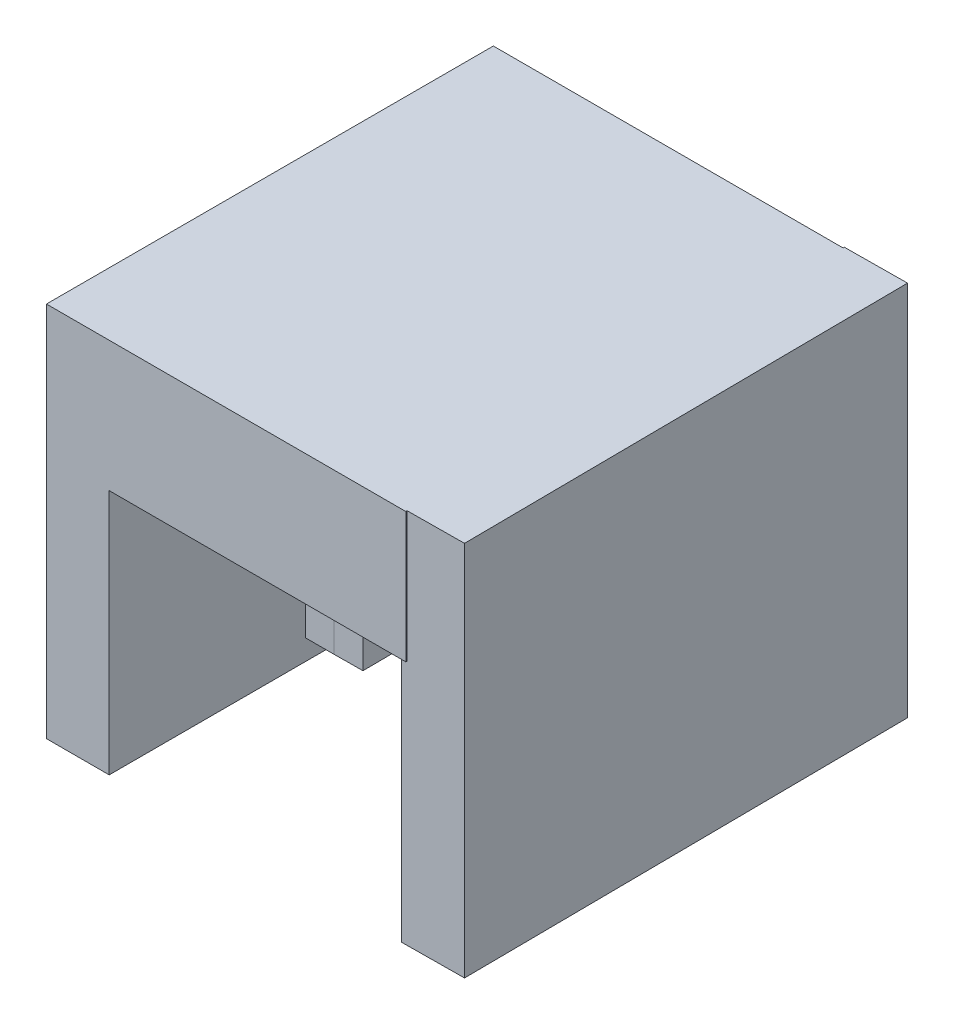
ISO-10303-21;
HEADER;
FILE_DESCRIPTION(('STEP AP214'),'2;1');
FILE_NAME('part.step','',(''),(''),'','','');
FILE_SCHEMA(('AUTOMOTIVE_DESIGN { 1 0 10303 214 1 1 1 1 }'));
ENDSEC;
DATA;
#1=APPLICATION_CONTEXT('core data for automotive mechanical design processes');
#2=APPLICATION_PROTOCOL_DEFINITION('international standard','automotive_design',2000,#1);
#3=PRODUCT_CONTEXT('',#1,'mechanical');
#4=PRODUCT('Part','Part','',(#3));
#5=PRODUCT_RELATED_PRODUCT_CATEGORY('part','',(#4));
#6=PRODUCT_DEFINITION_FORMATION('','',#4);
#7=PRODUCT_DEFINITION_CONTEXT('part definition',#1,'design');
#8=PRODUCT_DEFINITION('design','',#6,#7);
#9=PRODUCT_DEFINITION_SHAPE('','',#8);
#10=(LENGTH_UNIT() NAMED_UNIT(*) SI_UNIT(.MILLI.,.METRE.));
#11=(NAMED_UNIT(*) PLANE_ANGLE_UNIT() SI_UNIT($,.RADIAN.));
#12=(NAMED_UNIT(*) SI_UNIT($,.STERADIAN.) SOLID_ANGLE_UNIT());
#13=UNCERTAINTY_MEASURE_WITH_UNIT(LENGTH_MEASURE(1.E-05),#10,'distance_accuracy_value','');
#14=(GEOMETRIC_REPRESENTATION_CONTEXT(3) GLOBAL_UNCERTAINTY_ASSIGNED_CONTEXT((#13)) GLOBAL_UNIT_ASSIGNED_CONTEXT((#10,
#11,#12)) REPRESENTATION_CONTEXT('',''));
#15=CARTESIAN_POINT('',(0.,0.,0.));
#16=DIRECTION('',(0.,0.,1.));
#17=DIRECTION('',(1.,0.,0.));
#18=AXIS2_PLACEMENT_3D('',#15,#16,#17);
#19=CARTESIAN_POINT('',(27.9970189702549,33.,-26.1043973727644));
#20=DIRECTION('',(1.,0.,0.));
#21=DIRECTION('',(0.,0.,-1.));
#22=AXIS2_PLACEMENT_3D('',#19,#20,#21);
#23=PLANE('',#22);
#24=DIRECTION('',(0.,0.,1.));
#25=VECTOR('',#24,1.);
#26=CARTESIAN_POINT('',(27.9970189702549,21.5839544086407,-26.1043973727644));
#27=LINE('',#26,#25);
#28=CARTESIAN_POINT('',(27.9970189702549,21.5839544086407,-31.9709533691748));
#29=VERTEX_POINT('',#28);
#30=CARTESIAN_POINT('',(27.9970189702549,21.5839544086407,-26.1043973727644));
#31=VERTEX_POINT('',#30);
#32=EDGE_CURVE('E262',#29,#31,#27,.T.);
#33=ORIENTED_EDGE('',*,*,#32,.F.);
#34=DIRECTION('',(0.,-1.,0.));
#35=VECTOR('',#34,1.);
#36=CARTESIAN_POINT('',(27.9970189702549,33.,-31.9709533691748));
#37=LINE('',#36,#35);
#38=CARTESIAN_POINT('',(27.9970189702549,12.,-31.9709533691748));
#39=VERTEX_POINT('',#38);
#40=EDGE_CURVE('E360',#29,#39,#37,.T.);
#41=ORIENTED_EDGE('',*,*,#40,.T.);
#42=DIRECTION('',(0.,0.,1.));
#43=VECTOR('',#42,1.);
#44=CARTESIAN_POINT('',(27.9970189702549,12.,-31.9709533691748));
#45=LINE('',#44,#43);
#46=CARTESIAN_POINT('',(27.9970189702549,12.,-26.1043973727644));
#47=VERTEX_POINT('',#46);
#48=EDGE_CURVE('E337',#39,#47,#45,.T.);
#49=ORIENTED_EDGE('',*,*,#48,.T.);
#50=DIRECTION('',(0.,-1.,0.));
#51=VECTOR('',#50,1.);
#52=CARTESIAN_POINT('',(27.9970189702549,33.,-26.1043973727644));
#53=LINE('',#52,#51);
#54=EDGE_CURVE('E40',#31,#47,#53,.T.);
#55=ORIENTED_EDGE('',*,*,#54,.F.);
#56=EDGE_LOOP('',(#33,#41,#49,#55));
#57=FACE_BOUND('',#56,.T.);
#58=ADVANCED_FACE('F33',(#57),#23,.F.);
#59=CARTESIAN_POINT('',(27.9970189702549,33.,-26.1043973727644));
#60=DIRECTION('',(0.,0.,-1.));
#61=DIRECTION('',(-1.,0.,0.));
#62=AXIS2_PLACEMENT_3D('',#59,#60,#61);
#63=PLANE('',#62);
#64=DIRECTION('',(1.,0.,0.));
#65=VECTOR('',#64,1.);
#66=CARTESIAN_POINT('',(27.9970189702549,21.5839544086407,-26.1043973727644));
#67=LINE('',#66,#65);
#68=CARTESIAN_POINT('',(30.4970193885017,21.5839544086407,-26.1043973727644));
#69=VERTEX_POINT('',#68);
#70=EDGE_CURVE('E264',#31,#69,#67,.T.);
#71=ORIENTED_EDGE('',*,*,#70,.F.);
#72=ORIENTED_EDGE('',*,*,#54,.T.);
#73=DIRECTION('',(-1.,0.,0.));
#74=VECTOR('',#73,1.);
#75=CARTESIAN_POINT('',(27.9970189702549,12.,-26.1043973727643));
#76=LINE('',#75,#74);
#77=CARTESIAN_POINT('',(30.4970193884969,12.,-26.1043973727643));
#78=VERTEX_POINT('',#77);
#79=EDGE_CURVE('E292',#78,#47,#76,.T.);
#80=ORIENTED_EDGE('',*,*,#79,.F.);
#81=DIRECTION('',(0.,-1.,0.));
#82=VECTOR('',#81,1.);
#83=CARTESIAN_POINT('',(30.4970193885017,33.,-26.1043973727644));
#84=LINE('',#83,#82);
#85=EDGE_CURVE('E427',#69,#78,#84,.T.);
#86=ORIENTED_EDGE('',*,*,#85,.F.);
#87=EDGE_LOOP('',(#71,#72,#80,#86));
#88=FACE_BOUND('',#87,.T.);
#89=ADVANCED_FACE('F440',(#88),#63,.F.);
#90=CARTESIAN_POINT('',(32.9969268277988,33.,-26.1259585921443));
#91=DIRECTION('',(-0.00862448630909563,0.,-0.999962808426345));
#92=DIRECTION('',(-0.999962808426346,0.,0.00862448630909563));
#93=AXIS2_PLACEMENT_3D('',#90,#91,#92);
#94=PLANE('',#93);
#95=DIRECTION('',(0.999962808426346,0.,-0.00862448630909563));
#96=VECTOR('',#95,1.);
#97=CARTESIAN_POINT('',(32.9969268277988,21.5839544086407,-26.1259585921443));
#98=LINE('',#97,#96);
#99=CARTESIAN_POINT('',(32.9969268277988,21.5839544086407,-26.1259585921443));
#100=VERTEX_POINT('',#99);
#101=EDGE_CURVE('E266',#69,#100,#98,.T.);
#102=ORIENTED_EDGE('',*,*,#101,.F.);
#103=ORIENTED_EDGE('',*,*,#85,.T.);
#104=DIRECTION('',(0.999962808426346,0.,-0.00862448630909563));
#105=VECTOR('',#104,1.);
#106=CARTESIAN_POINT('',(32.9969268277988,12.,-26.1259585921443));
#107=LINE('',#106,#105);
#108=CARTESIAN_POINT('',(32.9969268277988,12.,-26.1259585921443));
#109=VERTEX_POINT('',#108);
#110=EDGE_CURVE('E297',#78,#109,#107,.T.);
#111=ORIENTED_EDGE('',*,*,#110,.T.);
#112=DIRECTION('',(0.,-1.,0.));
#113=VECTOR('',#112,1.);
#114=CARTESIAN_POINT('',(32.9969268277988,33.,-26.1259585921443));
#115=LINE('',#114,#113);
#116=EDGE_CURVE('E425',#100,#109,#115,.T.);
#117=ORIENTED_EDGE('',*,*,#116,.F.);
#118=EDGE_LOOP('',(#102,#103,#111,#117));
#119=FACE_BOUND('',#118,.T.);
#120=ADVANCED_FACE('F432',(#119),#94,.F.);
#121=CARTESIAN_POINT('',(32.9969268277988,33.,-26.1259585921443));
#122=DIRECTION('',(-0.999962808426345,0.,0.00862448630909741));
#123=DIRECTION('',(0.00862448630909741,0.,0.999962808426346));
#124=AXIS2_PLACEMENT_3D('',#121,#122,#123);
#125=PLANE('',#124);
#126=DIRECTION('',(-0.00862448630909741,0.,-0.999962808426346));
#127=VECTOR('',#126,1.);
#128=CARTESIAN_POINT('',(32.9969268277988,21.5839544086407,-26.1259585921443));
#129=LINE('',#128,#127);
#130=CARTESIAN_POINT('',(32.9463307959262,21.5839544086407,-31.9922964021052));
#131=VERTEX_POINT('',#130);
#132=EDGE_CURVE('E268',#100,#131,#129,.T.);
#133=ORIENTED_EDGE('',*,*,#132,.F.);
#134=ORIENTED_EDGE('',*,*,#116,.T.);
#135=DIRECTION('',(-0.00862448630909741,0.,-0.999962808426346));
#136=VECTOR('',#135,1.);
#137=CARTESIAN_POINT('',(32.9969268277988,12.,-26.1259585921443));
#138=LINE('',#137,#136);
#139=CARTESIAN_POINT('',(32.9463307959262,12.,-31.9922964021052));
#140=VERTEX_POINT('',#139);
#141=EDGE_CURVE('E335',#109,#140,#138,.T.);
#142=ORIENTED_EDGE('',*,*,#141,.T.);
#143=DIRECTION('',(0.,-1.,0.));
#144=VECTOR('',#143,1.);
#145=CARTESIAN_POINT('',(32.9463307959262,33.,-31.9922964021052));
#146=LINE('',#145,#144);
#147=EDGE_CURVE('E54',#131,#140,#146,.T.);
#148=ORIENTED_EDGE('',*,*,#147,.F.);
#149=EDGE_LOOP('',(#133,#134,#142,#148));
#150=FACE_BOUND('',#149,.T.);
#151=ADVANCED_FACE('F446',(#150),#125,.F.);
#152=CARTESIAN_POINT('',(30.4738372348107,33.,-37.7049418751643));
#153=DIRECTION('',(0.,-1.,0.));
#154=DIRECTION('',(0.,0.,-1.));
#155=AXIS2_PLACEMENT_3D('',#152,#153,#154);
#156=CYLINDRICAL_SURFACE('',#155,6.22475242163252);
#157=CARTESIAN_POINT('',(30.4738372348107,21.5839544086407,-37.7049418751643));
#158=DIRECTION('',(0.,1.,0.));
#159=DIRECTION('',(0.,0.,1.));
#160=AXIS2_PLACEMENT_3D('',#157,#158,#159);
#161=CIRCLE('',#160,6.22475242163252);
#162=CARTESIAN_POINT('',(35.8638647298149,21.5839544086407,-34.5912388845566));
#163=VERTEX_POINT('',#162);
#164=EDGE_CURVE('E270',#131,#163,#161,.T.);
#165=ORIENTED_EDGE('',*,*,#164,.F.);
#166=ORIENTED_EDGE('',*,*,#147,.T.);
#167=CARTESIAN_POINT('',(30.4738372348107,12.,-37.7049418751644));
#168=DIRECTION('',(0.,1.,0.));
#169=DIRECTION('',(0.,0.,1.));
#170=AXIS2_PLACEMENT_3D('',#167,#168,#169);
#171=CIRCLE('',#170,6.22475242163263);
#172=CARTESIAN_POINT('',(35.8638647298149,12.,-34.5912388845566));
#173=VERTEX_POINT('',#172);
#174=EDGE_CURVE('E333',#140,#173,#171,.T.);
#175=ORIENTED_EDGE('',*,*,#174,.T.);
#176=DIRECTION('',(0.,-1.,0.));
#177=VECTOR('',#176,1.);
#178=CARTESIAN_POINT('',(35.8638647298149,33.,-34.5912388845566));
#179=LINE('',#178,#177);
#180=EDGE_CURVE('E422',#163,#173,#179,.T.);
#181=ORIENTED_EDGE('',*,*,#180,.F.);
#182=EDGE_LOOP('',(#165,#166,#175,#181));
#183=FACE_BOUND('',#182,.T.);
#184=ADVANCED_FACE('F452',(#183),#156,.T.);
#185=CARTESIAN_POINT('',(35.8638647298149,33.,-34.5912388845566));
#186=DIRECTION('',(-0.246647604540995,0.,-0.969105236377448));
#187=DIRECTION('',(-0.969105236377448,0.,0.246647604540995));
#188=AXIS2_PLACEMENT_3D('',#185,#186,#187);
#189=PLANE('',#188);
#190=DIRECTION('',(0.969105236377448,0.,-0.246647604540995));
#191=VECTOR('',#190,1.);
#192=CARTESIAN_POINT('',(35.8638647298149,21.5839544086407,-34.5912388845566));
#193=LINE('',#192,#191);
#194=CARTESIAN_POINT('',(40.4315397694171,21.5839544086407,-35.7537608321739));
#195=VERTEX_POINT('',#194);
#196=EDGE_CURVE('E272',#163,#195,#193,.T.);
#197=ORIENTED_EDGE('',*,*,#196,.F.);
#198=ORIENTED_EDGE('',*,*,#180,.T.);
#199=DIRECTION('',(0.969105236377448,0.,-0.246647604540994));
#200=VECTOR('',#199,1.);
#201=CARTESIAN_POINT('',(35.8638647298149,12.,-34.5912388845566));
#202=LINE('',#201,#200);
#203=CARTESIAN_POINT('',(40.4315397694171,12.,-35.7537608321739));
#204=VERTEX_POINT('',#203);
#205=EDGE_CURVE('E330',#173,#204,#202,.T.);
#206=ORIENTED_EDGE('',*,*,#205,.T.);
#207=DIRECTION('',(0.,-1.,0.));
#208=VECTOR('',#207,1.);
#209=CARTESIAN_POINT('',(40.4315397694171,33.,-35.7537608321739));
#210=LINE('',#209,#208);
#211=EDGE_CURVE('E420',#195,#204,#210,.T.);
#212=ORIENTED_EDGE('',*,*,#211,.F.);
#213=EDGE_LOOP('',(#197,#198,#206,#212));
#214=FACE_BOUND('',#213,.T.);
#215=ADVANCED_FACE('F456',(#214),#189,.F.);
#216=CARTESIAN_POINT('',(40.4315397694171,33.,-35.7537608321739));
#217=DIRECTION('',(0.192290170789592,0.,-0.981338112078457));
#218=DIRECTION('',(-0.981338112078457,0.,-0.192290170789592));
#219=AXIS2_PLACEMENT_3D('',#216,#217,#218);
#220=PLANE('',#219);
#221=DIRECTION('',(0.981338112078457,0.,0.192290170789592));
#222=VECTOR('',#221,1.);
#223=CARTESIAN_POINT('',(40.4315397694171,21.5839544086407,-35.7537608321739));
#224=LINE('',#223,#222);
#225=CARTESIAN_POINT('',(43.1362110965658,21.5839544086407,-35.223788842881));
#226=VERTEX_POINT('',#225);
#227=EDGE_CURVE('E274',#195,#226,#224,.T.);
#228=ORIENTED_EDGE('',*,*,#227,.F.);
#229=ORIENTED_EDGE('',*,*,#211,.T.);
#230=DIRECTION('',(0.981338112078457,0.,0.192290170789592));
#231=VECTOR('',#230,1.);
#232=CARTESIAN_POINT('',(40.4315397694171,12.,-35.7537608321739));
#233=LINE('',#232,#231);
#234=CARTESIAN_POINT('',(43.1362110965658,12.,-35.223788842881));
#235=VERTEX_POINT('',#234);
#236=EDGE_CURVE('E327',#204,#235,#233,.T.);
#237=ORIENTED_EDGE('',*,*,#236,.T.);
#238=DIRECTION('',(0.,-1.,0.));
#239=VECTOR('',#238,1.);
#240=CARTESIAN_POINT('',(43.1362110965658,33.,-35.223788842881));
#241=LINE('',#240,#239);
#242=EDGE_CURVE('E418',#226,#235,#241,.T.);
#243=ORIENTED_EDGE('',*,*,#242,.F.);
#244=EDGE_LOOP('',(#228,#229,#237,#243));
#245=FACE_BOUND('',#244,.T.);
#246=ADVANCED_FACE('F459',(#245),#220,.F.);
#247=CARTESIAN_POINT('',(43.2743821323213,33.,-19.203600276804));
#248=DIRECTION('',(-0.00862448630909776,0.,-0.999962808426345));
#249=DIRECTION('',(-0.999962808426346,0.,0.00862448630909776));
#250=AXIS2_PLACEMENT_3D('',#247,#248,#249);
#251=PLANE('',#250);
#252=DIRECTION('',(0.999962808426346,0.,-0.00862448630909776));
#253=VECTOR('',#252,1.);
#254=CARTESIAN_POINT('',(43.2743821323213,21.5839544086407,-19.203600276804));
#255=LINE('',#254,#253);
#256=CARTESIAN_POINT('',(43.2743821323213,21.5839544086407,-19.203600276804));
#257=VERTEX_POINT('',#256);
#258=CARTESIAN_POINT('',(43.7796476849856,21.5839544086407,-19.2079580947195));
#259=VERTEX_POINT('',#258);
#260=EDGE_CURVE('E231',#257,#259,#255,.T.);
#261=ORIENTED_EDGE('',*,*,#260,.F.);
#262=DIRECTION('',(0.,-1.,0.));
#263=VECTOR('',#262,1.);
#264=CARTESIAN_POINT('',(43.2743821323213,33.,-19.203600276804));
#265=LINE('',#264,#263);
#266=CARTESIAN_POINT('',(43.2743821323213,0.,-19.203600276804));
#267=VERTEX_POINT('',#266);
#268=EDGE_CURVE('E416',#257,#267,#265,.T.);
#269=ORIENTED_EDGE('',*,*,#268,.T.);
#270=DIRECTION('',(0.999962808426345,0.,-0.00862448630909776));
#271=VECTOR('',#270,1.);
#272=CARTESIAN_POINT('',(43.2743821323213,0.,-19.203600276804));
#273=LINE('',#272,#271);
#274=CARTESIAN_POINT('',(48.7741775786662,0.,-19.251034951504));
#275=VERTEX_POINT('',#274);
#276=EDGE_CURVE('E304',#267,#275,#273,.T.);
#277=ORIENTED_EDGE('',*,*,#276,.T.);
#278=DIRECTION('',(0.,-1.,0.));
#279=VECTOR('',#278,1.);
#280=CARTESIAN_POINT('',(48.7741775786662,33.,-19.251034951504));
#281=LINE('',#280,#279);
#282=CARTESIAN_POINT('',(48.7741775786662,33.,-19.251034951504));
#283=VERTEX_POINT('',#282);
#284=EDGE_CURVE('E413',#283,#275,#281,.T.);
#285=ORIENTED_EDGE('',*,*,#284,.F.);
#286=DIRECTION('',(0.999962808426345,0.,-0.00862448630909776));
#287=VECTOR('',#286,1.);
#288=CARTESIAN_POINT('',(43.2743821323213,33.,-19.203600276804));
#289=LINE('',#288,#287);
#290=CARTESIAN_POINT('',(43.7796476849856,33.,-19.2079580947195));
#291=VERTEX_POINT('',#290);
#292=EDGE_CURVE('E344',#291,#283,#289,.T.);
#293=ORIENTED_EDGE('',*,*,#292,.F.);
#294=DIRECTION('',(0.,-1.,0.));
#295=VECTOR('',#294,1.);
#296=CARTESIAN_POINT('',(43.7796476849856,33.,-19.2079580947195));
#297=LINE('',#296,#295);
#298=EDGE_CURVE('E249',#291,#259,#297,.T.);
#299=ORIENTED_EDGE('',*,*,#298,.T.);
#300=EDGE_LOOP('',(#261,#269,#277,#285,#293,#299));
#301=FACE_BOUND('',#300,.T.);
#302=ADVANCED_FACE('F463',(#301),#251,.F.);
#303=CARTESIAN_POINT('',(42.9365132233006,33.,-58.3776833509426));
#304=DIRECTION('',(0.999962808426345,0.,-0.00862448630909662));
#305=DIRECTION('',(-0.00862448630909662,0.,-0.999962808426346));
#306=AXIS2_PLACEMENT_3D('',#303,#304,#305);
#307=PLANE('',#306);
#308=DIRECTION('',(0.00862448630909662,0.,0.999962808426346));
#309=VECTOR('',#308,1.);
#310=CARTESIAN_POINT('',(42.9365132233006,21.5839544086407,-58.3776833509426));
#311=LINE('',#310,#309);
#312=EDGE_CURVE('E276',#226,#257,#311,.T.);
#313=ORIENTED_EDGE('',*,*,#312,.F.);
#314=ORIENTED_EDGE('',*,*,#242,.T.);
#315=DIRECTION('',(-0.0086244863090982,0.,-0.999962808426346));
#316=VECTOR('',#315,1.);
#317=CARTESIAN_POINT('',(43.1362110965658,12.,-35.223788842881));
#318=LINE('',#317,#316);
#319=CARTESIAN_POINT('',(43.0881960389902,12.,-40.7908765625737));
#320=VERTEX_POINT('',#319);
#321=EDGE_CURVE('E324',#235,#320,#318,.T.);
#322=ORIENTED_EDGE('',*,*,#321,.T.);
#323=DIRECTION('',(0.,-1.,0.));
#324=VECTOR('',#323,1.);
#325=CARTESIAN_POINT('',(43.0881960389902,33.,-40.7908765625737));
#326=LINE('',#325,#324);
#327=CARTESIAN_POINT('',(43.0881960389902,21.5839544086407,-40.7908765625737));
#328=VERTEX_POINT('',#327);
#329=EDGE_CURVE('E405',#328,#320,#326,.T.);
#330=ORIENTED_EDGE('',*,*,#329,.F.);
#331=CARTESIAN_POINT('',(42.9374488815168,21.5839544086407,-58.2691988123798));
#332=VERTEX_POINT('',#331);
#333=EDGE_CURVE('E278',#332,#328,#311,.T.);
#334=ORIENTED_EDGE('',*,*,#333,.F.);
#335=DIRECTION('',(0.,-1.,0.));
#336=VECTOR('',#335,1.);
#337=CARTESIAN_POINT('',(42.9374488815168,33.,-58.2691988123798));
#338=LINE('',#337,#336);
#339=CARTESIAN_POINT('',(42.9374488815168,33.,-58.2691988123798));
#340=VERTEX_POINT('',#339);
#341=EDGE_CURVE('E252',#340,#332,#338,.T.);
#342=ORIENTED_EDGE('',*,*,#341,.F.);
#343=DIRECTION('',(0.00862448630909662,0.,0.999962808426346));
#344=VECTOR('',#343,1.);
#345=CARTESIAN_POINT('',(42.9365132233006,33.,-58.3776833509426));
#346=LINE('',#345,#344);
#347=CARTESIAN_POINT('',(42.9365132233006,33.,-58.3776833509426));
#348=VERTEX_POINT('',#347);
#349=EDGE_CURVE('E351',#348,#340,#346,.T.);
#350=ORIENTED_EDGE('',*,*,#349,.F.);
#351=DIRECTION('',(0.,-1.,0.));
#352=VECTOR('',#351,1.);
#353=CARTESIAN_POINT('',(42.9365132233006,33.,-58.3776833509426));
#354=LINE('',#353,#352);
#355=CARTESIAN_POINT('',(42.9365132233006,0.,-58.3776833509426));
#356=VERTEX_POINT('',#355);
#357=EDGE_CURVE('E407',#348,#356,#354,.T.);
#358=ORIENTED_EDGE('',*,*,#357,.T.);
#359=DIRECTION('',(0.00862448630909662,0.,0.999962808426346));
#360=VECTOR('',#359,1.);
#361=CARTESIAN_POINT('',(42.9365132233006,0.,-58.3776833509426));
#362=LINE('',#361,#360);
#363=EDGE_CURVE('E366',#356,#267,#362,.T.);
#364=ORIENTED_EDGE('',*,*,#363,.T.);
#365=ORIENTED_EDGE('',*,*,#268,.F.);
#366=EDGE_LOOP('',(#313,#314,#322,#330,#334,#342,#350,#358,#364,#365));
#367=FACE_BOUND('',#366,.T.);
#368=ADVANCED_FACE('F467',(#367),#307,.F.);
#369=CARTESIAN_POINT('',(43.0881960389902,33.,-40.7908765625737));
#370=DIRECTION('',(0.295076846057064,0.,0.955473523924664));
#371=DIRECTION('',(0.955473523924664,0.,-0.295076846057064));
#372=AXIS2_PLACEMENT_3D('',#369,#370,#371);
#373=PLANE('',#372);
#374=DIRECTION('',(-0.955473523924664,0.,0.295076846057064));
#375=VECTOR('',#374,1.);
#376=CARTESIAN_POINT('',(43.0881960389902,21.5839544086407,-40.7908765625737));
#377=LINE('',#376,#375);
#378=CARTESIAN_POINT('',(40.3952684480576,21.5839544086407,-39.9592254908323));
#379=VERTEX_POINT('',#378);
#380=EDGE_CURVE('E290',#328,#379,#377,.T.);
#381=ORIENTED_EDGE('',*,*,#380,.F.);
#382=ORIENTED_EDGE('',*,*,#329,.T.);
#383=DIRECTION('',(-0.955473523924664,0.,0.295076846057064));
#384=VECTOR('',#383,1.);
#385=CARTESIAN_POINT('',(43.0881960389902,12.,-40.7908765625737));
#386=LINE('',#385,#384);
#387=CARTESIAN_POINT('',(40.3952684480576,12.,-39.9592254908323));
#388=VERTEX_POINT('',#387);
#389=EDGE_CURVE('E321',#320,#388,#386,.T.);
#390=ORIENTED_EDGE('',*,*,#389,.T.);
#391=DIRECTION('',(0.,-1.,0.));
#392=VECTOR('',#391,1.);
#393=CARTESIAN_POINT('',(40.3952684480576,33.,-39.9592254908323));
#394=LINE('',#393,#392);
#395=EDGE_CURVE('E403',#379,#388,#394,.T.);
#396=ORIENTED_EDGE('',*,*,#395,.F.);
#397=EDGE_LOOP('',(#381,#382,#390,#396));
#398=FACE_BOUND('',#397,.T.);
#399=ADVANCED_FACE('F481',(#398),#373,.F.);
#400=CARTESIAN_POINT('',(35.8886314142691,33.,-40.7753729043073));
#401=DIRECTION('',(-0.178200359676966,0.,0.983994223464244));
#402=DIRECTION('',(0.983994223464244,0.,0.178200359676966));
#403=AXIS2_PLACEMENT_3D('',#400,#401,#402);
#404=PLANE('',#403);
#405=DIRECTION('',(-0.983994223464244,0.,-0.178200359676966));
#406=VECTOR('',#405,1.);
#407=CARTESIAN_POINT('',(35.8886314142691,21.5839544086407,-40.7753729043073));
#408=LINE('',#407,#406);
#409=CARTESIAN_POINT('',(35.8886314142691,21.5839544086407,-40.7753729043073));
#410=VERTEX_POINT('',#409);
#411=EDGE_CURVE('E288',#379,#410,#408,.T.);
#412=ORIENTED_EDGE('',*,*,#411,.F.);
#413=ORIENTED_EDGE('',*,*,#395,.T.);
#414=DIRECTION('',(-0.983994223464244,0.,-0.178200359676966));
#415=VECTOR('',#414,1.);
#416=CARTESIAN_POINT('',(40.3952684480576,12.,-39.9592254908323));
#417=LINE('',#416,#415);
#418=CARTESIAN_POINT('',(35.8886314142691,12.,-40.7753729043073));
#419=VERTEX_POINT('',#418);
#420=EDGE_CURVE('E318',#388,#419,#417,.T.);
#421=ORIENTED_EDGE('',*,*,#420,.T.);
#422=DIRECTION('',(0.,-1.,0.));
#423=VECTOR('',#422,1.);
#424=CARTESIAN_POINT('',(35.8886314142691,33.,-40.7753729043073));
#425=LINE('',#424,#423);
#426=EDGE_CURVE('E401',#410,#419,#425,.T.);
#427=ORIENTED_EDGE('',*,*,#426,.F.);
#428=EDGE_LOOP('',(#412,#413,#421,#427));
#429=FACE_BOUND('',#428,.T.);
#430=ADVANCED_FACE('F485',(#429),#404,.F.);
#431=CARTESIAN_POINT('',(30.4738372348107,33.,-37.7049418751643));
#432=DIRECTION('',(0.,-1.,0.));
#433=DIRECTION('',(0.,0.,-1.));
#434=AXIS2_PLACEMENT_3D('',#431,#432,#433);
#435=CYLINDRICAL_SURFACE('',#434,6.22475242163252);
#436=CARTESIAN_POINT('',(30.4738372348107,21.5839544086407,-37.7049418751643));
#437=DIRECTION('',(0.,1.,0.));
#438=DIRECTION('',(0.,0.,1.));
#439=AXIS2_PLACEMENT_3D('',#436,#437,#438);
#440=CIRCLE('',#439,6.22475242163252);
#441=CARTESIAN_POINT('',(30.4201519427729,21.5839544086407,-43.9294627884586));
#442=VERTEX_POINT('',#441);
#443=EDGE_CURVE('E286',#410,#442,#440,.T.);
#444=ORIENTED_EDGE('',*,*,#443,.F.);
#445=ORIENTED_EDGE('',*,*,#426,.T.);
#446=CARTESIAN_POINT('',(30.4738372348107,12.,-37.7049418751643));
#447=DIRECTION('',(0.,1.,0.));
#448=DIRECTION('',(0.,0.,1.));
#449=AXIS2_PLACEMENT_3D('',#446,#447,#448);
#450=CIRCLE('',#449,6.22475242163252);
#451=CARTESIAN_POINT('',(30.4201519427729,12.,-43.9294627884587));
#452=VERTEX_POINT('',#451);
#453=EDGE_CURVE('E294',#419,#452,#450,.T.);
#454=ORIENTED_EDGE('',*,*,#453,.T.);
#455=DIRECTION('',(0.,-1.,0.));
#456=VECTOR('',#455,1.);
#457=CARTESIAN_POINT('',(30.4201519427729,33.,-43.9294627884587));
#458=LINE('',#457,#456);
#459=EDGE_CURVE('E399',#442,#452,#458,.T.);
#460=ORIENTED_EDGE('',*,*,#459,.F.);
#461=EDGE_LOOP('',(#444,#445,#454,#460));
#462=FACE_BOUND('',#461,.T.);
#463=ADVANCED_FACE('F489',(#462),#435,.T.);
#464=CARTESIAN_POINT('',(30.4201519427729,33.,-37.7047103668261));
#465=DIRECTION('',(0.,-1.,0.));
#466=DIRECTION('',(0.,0.,-1.));
#467=AXIS2_PLACEMENT_3D('',#464,#465,#466);
#468=CYLINDRICAL_SURFACE('',#467,6.22475242163251);
#469=CARTESIAN_POINT('',(30.4201519427729,21.5839544086407,-37.7047103668261));
#470=DIRECTION('',(0.,1.,0.));
#471=DIRECTION('',(0.,0.,1.));
#472=AXIS2_PLACEMENT_3D('',#469,#470,#471);
#473=CIRCLE('',#472,6.22475242163251);
#474=CARTESIAN_POINT('',(24.9790782576572,21.5839544086407,-40.72832738354));
#475=VERTEX_POINT('',#474);
#476=EDGE_CURVE('E284',#442,#475,#473,.T.);
#477=ORIENTED_EDGE('',*,*,#476,.F.);
#478=ORIENTED_EDGE('',*,*,#459,.T.);
#479=CARTESIAN_POINT('',(30.4201519427729,12.,-37.7047103668261));
#480=DIRECTION('',(0.,1.,0.));
#481=DIRECTION('',(0.,0.,1.));
#482=AXIS2_PLACEMENT_3D('',#479,#480,#481);
#483=CIRCLE('',#482,6.22475242163256);
#484=CARTESIAN_POINT('',(24.9790782576572,12.,-40.72832738354));
#485=VERTEX_POINT('',#484);
#486=EDGE_CURVE('E315',#452,#485,#483,.T.);
#487=ORIENTED_EDGE('',*,*,#486,.T.);
#488=DIRECTION('',(0.,-1.,0.));
#489=VECTOR('',#488,1.);
#490=CARTESIAN_POINT('',(24.9790782576572,33.,-40.72832738354));
#491=LINE('',#490,#489);
#492=EDGE_CURVE('E397',#475,#485,#491,.T.);
#493=ORIENTED_EDGE('',*,*,#492,.F.);
#494=EDGE_LOOP('',(#477,#478,#487,#493));
#495=FACE_BOUND('',#494,.T.);
#496=ADVANCED_FACE('F493',(#495),#468,.T.);
#497=CARTESIAN_POINT('',(24.9790782576572,33.,-40.72832738354));
#498=DIRECTION('',(0.186680176833693,0.,0.98242074060829));
#499=DIRECTION('',(0.98242074060829,0.,-0.186680176833693));
#500=AXIS2_PLACEMENT_3D('',#497,#498,#499);
#501=PLANE('',#500);
#502=DIRECTION('',(-0.98242074060829,0.,0.186680176833693));
#503=VECTOR('',#502,1.);
#504=CARTESIAN_POINT('',(24.9790782576572,21.5839544086407,-40.72832738354));
#505=LINE('',#504,#503);
#506=CARTESIAN_POINT('',(20.4796476849856,21.5839544086407,-39.8733428944736));
#507=VERTEX_POINT('',#506);
#508=EDGE_CURVE('E282',#475,#507,#505,.T.);
#509=ORIENTED_EDGE('',*,*,#508,.F.);
#510=ORIENTED_EDGE('',*,*,#492,.T.);
#511=DIRECTION('',(-0.98242074060829,0.,0.186680176833693));
#512=VECTOR('',#511,1.);
#513=CARTESIAN_POINT('',(20.4796476849856,12.,-39.8733428944736));
#514=LINE('',#513,#512);
#515=CARTESIAN_POINT('',(20.4796476849856,12.,-39.8733428944736));
#516=VERTEX_POINT('',#515);
#517=EDGE_CURVE('E312',#485,#516,#514,.T.);
#518=ORIENTED_EDGE('',*,*,#517,.T.);
#519=DIRECTION('',(0.,-1.,0.));
#520=VECTOR('',#519,1.);
#521=CARTESIAN_POINT('',(20.4796476849856,33.,-39.8733428944736));
#522=LINE('',#521,#520);
#523=EDGE_CURVE('E395',#507,#516,#522,.T.);
#524=ORIENTED_EDGE('',*,*,#523,.F.);
#525=EDGE_LOOP('',(#509,#510,#518,#524));
#526=FACE_BOUND('',#525,.T.);
#527=ADVANCED_FACE('F497',(#526),#501,.F.);
#528=CARTESIAN_POINT('',(17.7796476849856,33.,-40.6817379186636));
#529=DIRECTION('',(-0.286825403359055,0.,0.957982874579664));
#530=DIRECTION('',(0.957982874579664,0.,0.286825403359055));
#531=AXIS2_PLACEMENT_3D('',#528,#529,#530);
#532=PLANE('',#531);
#533=DIRECTION('',(-0.957982874579664,0.,-0.286825403359055));
#534=VECTOR('',#533,1.);
#535=CARTESIAN_POINT('',(17.7796476849856,21.5839544086407,-40.6817379186636));
#536=LINE('',#535,#534);
#537=CARTESIAN_POINT('',(17.7796476849856,21.5839544086407,-40.6817379186636));
#538=VERTEX_POINT('',#537);
#539=EDGE_CURVE('E280',#507,#538,#536,.T.);
#540=ORIENTED_EDGE('',*,*,#539,.F.);
#541=ORIENTED_EDGE('',*,*,#523,.T.);
#542=DIRECTION('',(-0.957982874579664,0.,-0.286825403359055));
#543=VECTOR('',#542,1.);
#544=CARTESIAN_POINT('',(17.7796476849856,12.,-40.6817379186636));
#545=LINE('',#544,#543);
#546=CARTESIAN_POINT('',(17.7796476849856,12.,-40.6817379186636));
#547=VERTEX_POINT('',#546);
#548=EDGE_CURVE('E309',#516,#547,#545,.T.);
#549=ORIENTED_EDGE('',*,*,#548,.T.);
#550=DIRECTION('',(0.,-1.,0.));
#551=VECTOR('',#550,1.);
#552=CARTESIAN_POINT('',(17.7796476849856,33.,-40.6817379186636));
#553=LINE('',#552,#551);
#554=EDGE_CURVE('E393',#538,#547,#553,.T.);
#555=ORIENTED_EDGE('',*,*,#554,.F.);
#556=EDGE_LOOP('',(#540,#541,#549,#555));
#557=FACE_BOUND('',#556,.T.);
#558=ADVANCED_FACE('F501',(#557),#532,.F.);
#559=CARTESIAN_POINT('',(17.7796476849856,33.,-35.1144431425172));
#560=DIRECTION('',(-1.,0.,0.));
#561=DIRECTION('',(0.,0.,1.));
#562=AXIS2_PLACEMENT_3D('',#559,#560,#561);
#563=PLANE('',#562);
#564=DIRECTION('',(0.,0.,-1.));
#565=VECTOR('',#564,1.);
#566=CARTESIAN_POINT('',(17.7796476849856,21.5839544086407,-19.093658738257));
#567=LINE('',#566,#565);
#568=CARTESIAN_POINT('',(17.7796476849856,21.5839544086407,-19.093658738257));
#569=VERTEX_POINT('',#568);
#570=CARTESIAN_POINT('',(17.7796476849856,21.5839544086407,-35.1144431425172));
#571=VERTEX_POINT('',#570);
#572=EDGE_CURVE('E243',#569,#571,#567,.T.);
#573=ORIENTED_EDGE('',*,*,#572,.F.);
#574=DIRECTION('',(0.,-1.,0.));
#575=VECTOR('',#574,1.);
#576=CARTESIAN_POINT('',(17.7796476849856,33.,-19.093658738257));
#577=LINE('',#576,#575);
#578=CARTESIAN_POINT('',(17.7796476849856,0.,-19.093658738257));
#579=VERTEX_POINT('',#578);
#580=EDGE_CURVE('E248',#569,#579,#577,.T.);
#581=ORIENTED_EDGE('',*,*,#580,.T.);
#582=DIRECTION('',(0.,0.,-1.));
#583=VECTOR('',#582,1.);
#584=CARTESIAN_POINT('',(17.7796476849856,0.,-35.1144431425172));
#585=LINE('',#584,#583);
#586=CARTESIAN_POINT('',(17.7796476849856,0.,-58.2691988123798));
#587=VERTEX_POINT('',#586);
#588=EDGE_CURVE('E347',#579,#587,#585,.T.);
#589=ORIENTED_EDGE('',*,*,#588,.T.);
#590=DIRECTION('',(0.,-1.,0.));
#591=VECTOR('',#590,1.);
#592=CARTESIAN_POINT('',(17.7796476849856,33.,-58.2691988123798));
#593=LINE('',#592,#591);
#594=CARTESIAN_POINT('',(17.7796476849856,21.5839544086407,-58.2691988123798));
#595=VERTEX_POINT('',#594);
#596=EDGE_CURVE('E391',#595,#587,#593,.T.);
#597=ORIENTED_EDGE('',*,*,#596,.F.);
#598=EDGE_CURVE('E556',#538,#595,#567,.T.);
#599=ORIENTED_EDGE('',*,*,#598,.F.);
#600=ORIENTED_EDGE('',*,*,#554,.T.);
#601=DIRECTION('',(0.,0.,1.));
#602=VECTOR('',#601,1.);
#603=CARTESIAN_POINT('',(17.7796476849856,12.,-35.1144431425172));
#604=LINE('',#603,#602);
#605=CARTESIAN_POINT('',(17.7796476849856,12.,-35.1144431425172));
#606=VERTEX_POINT('',#605);
#607=EDGE_CURVE('E306',#547,#606,#604,.T.);
#608=ORIENTED_EDGE('',*,*,#607,.T.);
#609=DIRECTION('',(0.,-1.,0.));
#610=VECTOR('',#609,1.);
#611=CARTESIAN_POINT('',(17.7796476849856,33.,-35.1144431425172));
#612=LINE('',#611,#610);
#613=EDGE_CURVE('E382',#571,#606,#612,.T.);
#614=ORIENTED_EDGE('',*,*,#613,.F.);
#615=EDGE_LOOP('',(#573,#581,#589,#597,#599,#600,#608,#614));
#616=FACE_BOUND('',#615,.T.);
#617=ADVANCED_FACE('F505',(#616),#563,.F.);
#618=CARTESIAN_POINT('',(20.4796476849856,33.,-35.6677218221494));
#619=DIRECTION('',(-0.200746556327764,0.,-0.979643210624431));
#620=DIRECTION('',(-0.979643210624431,0.,0.200746556327765));
#621=AXIS2_PLACEMENT_3D('',#618,#619,#620);
#622=PLANE('',#621);
#623=DIRECTION('',(0.979643210624431,0.,-0.200746556327765));
#624=VECTOR('',#623,1.);
#625=CARTESIAN_POINT('',(20.4796476849856,21.5839544086407,-35.6677218221494));
#626=LINE('',#625,#624);
#627=CARTESIAN_POINT('',(20.4796476849856,21.5839544086407,-35.6677218221494));
#628=VERTEX_POINT('',#627);
#629=EDGE_CURVE('E260',#571,#628,#626,.T.);
#630=ORIENTED_EDGE('',*,*,#629,.F.);
#631=ORIENTED_EDGE('',*,*,#613,.T.);
#632=DIRECTION('',(0.979643210624431,0.,-0.200746556327765));
#633=VECTOR('',#632,1.);
#634=CARTESIAN_POINT('',(20.4796476849856,12.,-35.6677218221494));
#635=LINE('',#634,#633);
#636=CARTESIAN_POINT('',(20.4796476849856,12.,-35.6677218221494));
#637=VERTEX_POINT('',#636);
#638=EDGE_CURVE('E300',#606,#637,#635,.T.);
#639=ORIENTED_EDGE('',*,*,#638,.T.);
#640=DIRECTION('',(0.,-1.,0.));
#641=VECTOR('',#640,1.);
#642=CARTESIAN_POINT('',(20.4796476849856,33.,-35.6677218221494));
#643=LINE('',#642,#641);
#644=EDGE_CURVE('E380',#628,#637,#643,.T.);
#645=ORIENTED_EDGE('',*,*,#644,.F.);
#646=EDGE_LOOP('',(#630,#631,#639,#645));
#647=FACE_BOUND('',#646,.T.);
#648=ADVANCED_FACE('F519',(#647),#622,.F.);
#649=CARTESIAN_POINT('',(25.0571790001864,33.,-34.5446369613963));
#650=DIRECTION('',(0.238280396485232,0.,-0.971196402717206));
#651=DIRECTION('',(-0.971196402717206,0.,-0.238280396485232));
#652=AXIS2_PLACEMENT_3D('',#649,#650,#651);
#653=PLANE('',#652);
#654=DIRECTION('',(0.971196402717206,0.,0.238280396485232));
#655=VECTOR('',#654,1.);
#656=CARTESIAN_POINT('',(25.0571790001864,21.5839544086407,-34.5446369613963));
#657=LINE('',#656,#655);
#658=CARTESIAN_POINT('',(25.0571790001864,21.5839544086407,-34.5446369613963));
#659=VERTEX_POINT('',#658);
#660=EDGE_CURVE('E258',#628,#659,#657,.T.);
#661=ORIENTED_EDGE('',*,*,#660,.F.);
#662=ORIENTED_EDGE('',*,*,#644,.T.);
#663=DIRECTION('',(0.971196402717206,0.,0.238280396485232));
#664=VECTOR('',#663,1.);
#665=CARTESIAN_POINT('',(25.0571790001864,12.,-34.5446369613963));
#666=LINE('',#665,#664);
#667=CARTESIAN_POINT('',(25.0571790001864,12.,-34.5446369613963));
#668=VERTEX_POINT('',#667);
#669=EDGE_CURVE('E301',#637,#668,#666,.T.);
#670=ORIENTED_EDGE('',*,*,#669,.T.);
#671=DIRECTION('',(0.,-1.,0.));
#672=VECTOR('',#671,1.);
#673=CARTESIAN_POINT('',(25.0571790001864,33.,-34.5446369613963));
#674=LINE('',#673,#672);
#675=EDGE_CURVE('E378',#659,#668,#674,.T.);
#676=ORIENTED_EDGE('',*,*,#675,.F.);
#677=EDGE_LOOP('',(#661,#662,#670,#676));
#678=FACE_BOUND('',#677,.T.);
#679=ADVANCED_FACE('F523',(#678),#653,.F.);
#680=CARTESIAN_POINT('',(30.4201519427729,33.,-37.7047103668261));
#681=DIRECTION('',(0.,-1.,0.));
#682=DIRECTION('',(0.,0.,-1.));
#683=AXIS2_PLACEMENT_3D('',#680,#681,#682);
#684=CYLINDRICAL_SURFACE('',#683,6.22475242163251);
#685=CARTESIAN_POINT('',(30.4201519427729,21.5839544086407,-37.7047103668261));
#686=DIRECTION('',(0.,1.,0.));
#687=DIRECTION('',(0.,0.,1.));
#688=AXIS2_PLACEMENT_3D('',#685,#686,#687);
#689=CIRCLE('',#688,6.22475242163251);
#690=EDGE_CURVE('E11',#659,#29,#689,.T.);
#691=ORIENTED_EDGE('',*,*,#690,.F.);
#692=ORIENTED_EDGE('',*,*,#675,.T.);
#693=CARTESIAN_POINT('',(30.4201519427729,12.,-37.7047103668262));
#694=DIRECTION('',(0.,1.,0.));
#695=DIRECTION('',(0.,0.,1.));
#696=AXIS2_PLACEMENT_3D('',#693,#694,#695);
#697=CIRCLE('',#696,6.22475242163255);
#698=EDGE_CURVE('E305',#668,#39,#697,.T.);
#699=ORIENTED_EDGE('',*,*,#698,.T.);
#700=ORIENTED_EDGE('',*,*,#40,.F.);
#701=EDGE_LOOP('',(#691,#692,#699,#700));
#702=FACE_BOUND('',#701,.T.);
#703=ADVANCED_FACE('F527',(#702),#684,.T.);
#704=CARTESIAN_POINT('',(30.4201519427729,0.,-37.7047103668261));
#705=DIRECTION('',(0.,1.,0.));
#706=DIRECTION('',(0.,0.,1.));
#707=AXIS2_PLACEMENT_3D('',#704,#705,#706);
#708=PLANE('',#707);
#709=ORIENTED_EDGE('',*,*,#276,.F.);
#710=ORIENTED_EDGE('',*,*,#363,.F.);
#711=DIRECTION('',(-0.999962808426346,0.,0.00862448630909529));
#712=VECTOR('',#711,1.);
#713=CARTESIAN_POINT('',(48.4363086696455,0.,-58.4251180256426));
#714=LINE('',#713,#712);
#715=CARTESIAN_POINT('',(48.4363086696455,0.,-58.4251180256426));
#716=VERTEX_POINT('',#715);
#717=EDGE_CURVE('E364',#716,#356,#714,.T.);
#718=ORIENTED_EDGE('',*,*,#717,.F.);
#719=DIRECTION('',(-0.008624486309097,0.,-0.999962808426346));
#720=VECTOR('',#719,1.);
#721=CARTESIAN_POINT('',(48.7741775786662,0.,-19.251034951504));
#722=LINE('',#721,#720);
#723=EDGE_CURVE('E362',#275,#716,#722,.T.);
#724=ORIENTED_EDGE('',*,*,#723,.F.);
#725=EDGE_LOOP('',(#709,#710,#718,#724));
#726=FACE_BOUND('',#725,.T.);
#727=ADVANCED_FACE('F531',(#726),#708,.F.);
#728=DIRECTION('',(-1.,0.,0.));
#729=VECTOR('',#728,1.);
#730=CARTESIAN_POINT('',(12.2796476849857,0.,-58.2691988123798));
#731=LINE('',#730,#729);
#732=CARTESIAN_POINT('',(12.2796476849857,0.,-58.2691988123798));
#733=VERTEX_POINT('',#732);
#734=EDGE_CURVE('E369',#587,#733,#731,.T.);
#735=ORIENTED_EDGE('',*,*,#734,.F.);
#736=ORIENTED_EDGE('',*,*,#588,.F.);
#737=DIRECTION('',(1.,0.,0.));
#738=VECTOR('',#737,1.);
#739=CARTESIAN_POINT('',(17.7796476849856,0.,-19.093658738257));
#740=LINE('',#739,#738);
#741=CARTESIAN_POINT('',(12.2796476849856,0.,-19.093658738257));
#742=VERTEX_POINT('',#741);
#743=EDGE_CURVE('E373',#742,#579,#740,.T.);
#744=ORIENTED_EDGE('',*,*,#743,.F.);
#745=DIRECTION('',(0.,0.,1.));
#746=VECTOR('',#745,1.);
#747=CARTESIAN_POINT('',(12.2796476849856,0.,-19.093658738257));
#748=LINE('',#747,#746);
#749=EDGE_CURVE('E371',#733,#742,#748,.T.);
#750=ORIENTED_EDGE('',*,*,#749,.F.);
#751=EDGE_LOOP('',(#735,#736,#744,#750));
#752=FACE_BOUND('',#751,.T.);
#753=ADVANCED_FACE('F473',(#752),#708,.F.);
#754=CARTESIAN_POINT('',(48.7741775786662,33.,-19.251034951504));
#755=DIRECTION('',(-0.999962808426345,0.,0.008624486309097));
#756=DIRECTION('',(0.008624486309097,0.,0.999962808426346));
#757=AXIS2_PLACEMENT_3D('',#754,#755,#756);
#758=PLANE('',#757);
#759=ORIENTED_EDGE('',*,*,#723,.T.);
#760=DIRECTION('',(0.,-1.,0.));
#761=VECTOR('',#760,1.);
#762=CARTESIAN_POINT('',(48.4363086696455,33.,-58.4251180256426));
#763=LINE('',#762,#761);
#764=CARTESIAN_POINT('',(48.4363086696455,33.,-58.4251180256426));
#765=VERTEX_POINT('',#764);
#766=EDGE_CURVE('E410',#765,#716,#763,.T.);
#767=ORIENTED_EDGE('',*,*,#766,.F.);
#768=DIRECTION('',(-0.008624486309097,0.,-0.999962808426346));
#769=VECTOR('',#768,1.);
#770=CARTESIAN_POINT('',(48.7741775786662,33.,-19.251034951504));
#771=LINE('',#770,#769);
#772=EDGE_CURVE('E346',#283,#765,#771,.T.);
#773=ORIENTED_EDGE('',*,*,#772,.F.);
#774=ORIENTED_EDGE('',*,*,#284,.T.);
#775=EDGE_LOOP('',(#759,#767,#773,#774));
#776=FACE_BOUND('',#775,.T.);
#777=ADVANCED_FACE('F469',(#776),#758,.F.);
#778=CARTESIAN_POINT('',(48.4363086696455,33.,-58.4251180256426));
#779=DIRECTION('',(0.00862448630909529,0.,0.999962808426345));
#780=DIRECTION('',(0.999962808426346,0.,-0.00862448630909529));
#781=AXIS2_PLACEMENT_3D('',#778,#779,#780);
#782=PLANE('',#781);
#783=ORIENTED_EDGE('',*,*,#717,.T.);
#784=ORIENTED_EDGE('',*,*,#357,.F.);
#785=DIRECTION('',(-0.999962808426346,0.,0.00862448630909529));
#786=VECTOR('',#785,1.);
#787=CARTESIAN_POINT('',(48.4363086696455,33.,-58.4251180256426));
#788=LINE('',#787,#786);
#789=EDGE_CURVE('E349',#765,#348,#788,.T.);
#790=ORIENTED_EDGE('',*,*,#789,.F.);
#791=ORIENTED_EDGE('',*,*,#766,.T.);
#792=EDGE_LOOP('',(#783,#784,#790,#791));
#793=FACE_BOUND('',#792,.T.);
#794=ADVANCED_FACE('F472',(#793),#782,.F.);
#795=CARTESIAN_POINT('',(12.2796476849857,33.,-58.2691988123798));
#796=DIRECTION('',(0.,0.,1.));
#797=DIRECTION('',(1.,0.,0.));
#798=AXIS2_PLACEMENT_3D('',#795,#796,#797);
#799=PLANE('',#798);
#800=ORIENTED_EDGE('',*,*,#734,.T.);
#801=DIRECTION('',(0.,-1.,0.));
#802=VECTOR('',#801,1.);
#803=CARTESIAN_POINT('',(12.2796476849857,33.,-58.2691988123798));
#804=LINE('',#803,#802);
#805=CARTESIAN_POINT('',(12.2796476849857,33.,-58.2691988123798));
#806=VERTEX_POINT('',#805);
#807=EDGE_CURVE('E388',#806,#733,#804,.T.);
#808=ORIENTED_EDGE('',*,*,#807,.F.);
#809=DIRECTION('',(-1.,0.,0.));
#810=VECTOR('',#809,1.);
#811=CARTESIAN_POINT('',(12.2796476849857,33.,-58.2691988123798));
#812=LINE('',#811,#810);
#813=EDGE_CURVE('E354',#340,#806,#812,.T.);
#814=ORIENTED_EDGE('',*,*,#813,.F.);
#815=ORIENTED_EDGE('',*,*,#341,.T.);
#816=DIRECTION('',(-1.,0.,0.));
#817=VECTOR('',#816,1.);
#818=CARTESIAN_POINT('',(43.7796476849856,21.5839544086407,-58.2691988123798));
#819=LINE('',#818,#817);
#820=EDGE_CURVE('E250',#332,#595,#819,.T.);
#821=ORIENTED_EDGE('',*,*,#820,.T.);
#822=ORIENTED_EDGE('',*,*,#596,.T.);
#823=EDGE_LOOP('',(#800,#808,#814,#815,#821,#822));
#824=FACE_BOUND('',#823,.T.);
#825=ADVANCED_FACE('F477',(#824),#799,.F.);
#826=CARTESIAN_POINT('',(12.2796476849856,33.,-19.093658738257));
#827=DIRECTION('',(1.,0.,0.));
#828=DIRECTION('',(0.,0.,-1.));
#829=AXIS2_PLACEMENT_3D('',#826,#827,#828);
#830=PLANE('',#829);
#831=ORIENTED_EDGE('',*,*,#749,.T.);
#832=DIRECTION('',(0.,-1.,0.));
#833=VECTOR('',#832,1.);
#834=CARTESIAN_POINT('',(12.2796476849856,33.,-19.093658738257));
#835=LINE('',#834,#833);
#836=CARTESIAN_POINT('',(12.2796476849856,33.,-19.093658738257));
#837=VERTEX_POINT('',#836);
#838=EDGE_CURVE('E385',#837,#742,#835,.T.);
#839=ORIENTED_EDGE('',*,*,#838,.F.);
#840=DIRECTION('',(0.,0.,1.));
#841=VECTOR('',#840,1.);
#842=CARTESIAN_POINT('',(12.2796476849856,33.,-19.093658738257));
#843=LINE('',#842,#841);
#844=EDGE_CURVE('E356',#806,#837,#843,.T.);
#845=ORIENTED_EDGE('',*,*,#844,.F.);
#846=ORIENTED_EDGE('',*,*,#807,.T.);
#847=EDGE_LOOP('',(#831,#839,#845,#846));
#848=FACE_BOUND('',#847,.T.);
#849=ADVANCED_FACE('F509',(#848),#830,.F.);
#850=CARTESIAN_POINT('',(17.7796476849856,33.,-19.093658738257));
#851=DIRECTION('',(0.,0.,-1.));
#852=DIRECTION('',(-1.,0.,0.));
#853=AXIS2_PLACEMENT_3D('',#850,#851,#852);
#854=PLANE('',#853);
#855=ORIENTED_EDGE('',*,*,#743,.T.);
#856=ORIENTED_EDGE('',*,*,#580,.F.);
#857=DIRECTION('',(-1.,0.,0.));
#858=VECTOR('',#857,1.);
#859=CARTESIAN_POINT('',(43.7796476849856,21.5839544086407,-19.093658738257));
#860=LINE('',#859,#858);
#861=CARTESIAN_POINT('',(43.7796476849856,21.5839544086407,-19.093658738257));
#862=VERTEX_POINT('',#861);
#863=EDGE_CURVE('E228',#862,#569,#860,.T.);
#864=ORIENTED_EDGE('',*,*,#863,.F.);
#865=DIRECTION('',(0.,-1.,0.));
#866=VECTOR('',#865,1.);
#867=CARTESIAN_POINT('',(43.7796476849856,33.,-19.093658738257));
#868=LINE('',#867,#866);
#869=CARTESIAN_POINT('',(43.7796476849856,33.,-19.093658738257));
#870=VERTEX_POINT('',#869);
#871=EDGE_CURVE('E235',#870,#862,#868,.T.);
#872=ORIENTED_EDGE('',*,*,#871,.F.);
#873=DIRECTION('',(1.,0.,0.));
#874=VECTOR('',#873,1.);
#875=CARTESIAN_POINT('',(17.7796476849856,33.,-19.093658738257));
#876=LINE('',#875,#874);
#877=EDGE_CURVE('E358',#837,#870,#876,.T.);
#878=ORIENTED_EDGE('',*,*,#877,.F.);
#879=ORIENTED_EDGE('',*,*,#838,.T.);
#880=EDGE_LOOP('',(#855,#856,#864,#872,#878,#879));
#881=FACE_BOUND('',#880,.T.);
#882=ADVANCED_FACE('F247',(#881),#854,.F.);
#883=CARTESIAN_POINT('',(30.4201519427729,33.,-37.7047103668261));
#884=DIRECTION('',(0.,1.,0.));
#885=DIRECTION('',(0.,0.,1.));
#886=AXIS2_PLACEMENT_3D('',#883,#884,#885);
#887=PLANE('',#886);
#888=DIRECTION('',(0.,0.,1.));
#889=VECTOR('',#888,1.);
#890=CARTESIAN_POINT('',(43.7796476849856,33.,-19.093658738257));
#891=LINE('',#890,#889);
#892=EDGE_CURVE('E234',#291,#870,#891,.T.);
#893=ORIENTED_EDGE('',*,*,#892,.F.);
#894=ORIENTED_EDGE('',*,*,#292,.T.);
#895=ORIENTED_EDGE('',*,*,#772,.T.);
#896=ORIENTED_EDGE('',*,*,#789,.T.);
#897=ORIENTED_EDGE('',*,*,#349,.T.);
#898=ORIENTED_EDGE('',*,*,#813,.T.);
#899=ORIENTED_EDGE('',*,*,#844,.T.);
#900=ORIENTED_EDGE('',*,*,#877,.T.);
#901=EDGE_LOOP('',(#893,#894,#895,#896,#897,#898,#899,#900));
#902=FACE_BOUND('',#901,.T.);
#903=ADVANCED_FACE('F516',(#902),#887,.T.);
#904=CARTESIAN_POINT('',(30.4201519427729,12.,-37.7047103668261));
#905=DIRECTION('',(0.,1.,0.));
#906=DIRECTION('',(0.,0.,1.));
#907=AXIS2_PLACEMENT_3D('',#904,#905,#906);
#908=PLANE('',#907);
#909=ORIENTED_EDGE('',*,*,#236,.F.);
#910=ORIENTED_EDGE('',*,*,#205,.F.);
#911=ORIENTED_EDGE('',*,*,#174,.F.);
#912=ORIENTED_EDGE('',*,*,#141,.F.);
#913=ORIENTED_EDGE('',*,*,#110,.F.);
#914=ORIENTED_EDGE('',*,*,#79,.T.);
#915=ORIENTED_EDGE('',*,*,#48,.F.);
#916=ORIENTED_EDGE('',*,*,#698,.F.);
#917=ORIENTED_EDGE('',*,*,#669,.F.);
#918=ORIENTED_EDGE('',*,*,#638,.F.);
#919=ORIENTED_EDGE('',*,*,#607,.F.);
#920=ORIENTED_EDGE('',*,*,#548,.F.);
#921=ORIENTED_EDGE('',*,*,#517,.F.);
#922=ORIENTED_EDGE('',*,*,#486,.F.);
#923=ORIENTED_EDGE('',*,*,#453,.F.);
#924=ORIENTED_EDGE('',*,*,#420,.F.);
#925=ORIENTED_EDGE('',*,*,#389,.F.);
#926=ORIENTED_EDGE('',*,*,#321,.F.);
#927=EDGE_LOOP('',(#909,#910,#911,#912,#913,#914,#915,#916,#917,#918,#919,#920,#921,#922,#923,
#924,#925,#926));
#928=FACE_BOUND('',#927,.T.);
#929=ADVANCED_FACE('F437',(#928),#908,.F.);
#930=CARTESIAN_POINT('',(43.7796476849856,21.5839544086407,-19.093658738257));
#931=DIRECTION('',(0.,1.,0.));
#932=DIRECTION('',(0.,0.,1.));
#933=AXIS2_PLACEMENT_3D('',#930,#931,#932);
#934=PLANE('',#933);
#935=ORIENTED_EDGE('',*,*,#820,.F.);
#936=ORIENTED_EDGE('',*,*,#333,.T.);
#937=ORIENTED_EDGE('',*,*,#380,.T.);
#938=ORIENTED_EDGE('',*,*,#411,.T.);
#939=ORIENTED_EDGE('',*,*,#443,.T.);
#940=ORIENTED_EDGE('',*,*,#476,.T.);
#941=ORIENTED_EDGE('',*,*,#508,.T.);
#942=ORIENTED_EDGE('',*,*,#539,.T.);
#943=ORIENTED_EDGE('',*,*,#598,.T.);
#944=EDGE_LOOP('',(#935,#936,#937,#938,#939,#940,#941,#942,#943));
#945=FACE_BOUND('',#944,.T.);
#946=ADVANCED_FACE('F541',(#945),#934,.F.);
#947=CARTESIAN_POINT('',(43.7796476849856,0.,0.));
#948=DIRECTION('',(1.,0.,0.));
#949=DIRECTION('',(0.,0.,-1.));
#950=AXIS2_PLACEMENT_3D('',#947,#948,#949);
#951=PLANE('',#950);
#952=ORIENTED_EDGE('',*,*,#298,.F.);
#953=ORIENTED_EDGE('',*,*,#892,.T.);
#954=ORIENTED_EDGE('',*,*,#871,.T.);
#955=DIRECTION('',(0.,0.,-1.));
#956=VECTOR('',#955,1.);
#957=CARTESIAN_POINT('',(43.7796476849856,21.5839544086407,-19.093658738257));
#958=LINE('',#957,#956);
#959=EDGE_CURVE('E224',#862,#259,#958,.T.);
#960=ORIENTED_EDGE('',*,*,#959,.T.);
#961=EDGE_LOOP('',(#952,#953,#954,#960));
#962=FACE_BOUND('',#961,.T.);
#963=ADVANCED_FACE('F239',(#962),#951,.T.);
#964=ORIENTED_EDGE('',*,*,#312,.T.);
#965=ORIENTED_EDGE('',*,*,#260,.T.);
#966=ORIENTED_EDGE('',*,*,#959,.F.);
#967=ORIENTED_EDGE('',*,*,#863,.T.);
#968=ORIENTED_EDGE('',*,*,#572,.T.);
#969=ORIENTED_EDGE('',*,*,#629,.T.);
#970=ORIENTED_EDGE('',*,*,#660,.T.);
#971=ORIENTED_EDGE('',*,*,#690,.T.);
#972=ORIENTED_EDGE('',*,*,#32,.T.);
#973=ORIENTED_EDGE('',*,*,#70,.T.);
#974=ORIENTED_EDGE('',*,*,#101,.T.);
#975=ORIENTED_EDGE('',*,*,#132,.T.);
#976=ORIENTED_EDGE('',*,*,#164,.T.);
#977=ORIENTED_EDGE('',*,*,#196,.T.);
#978=ORIENTED_EDGE('',*,*,#227,.T.);
#979=EDGE_LOOP('',(#964,#965,#966,#967,#968,#969,#970,#971,#972,#973,#974,#975,#976,#977,#978));
#980=FACE_BOUND('',#979,.T.);
#981=ADVANCED_FACE('F226',(#980),#934,.F.);
#982=CLOSED_SHELL('',(#58,#89,#120,#151,#184,#215,#246,#302,#368,#399,#430,#463,#496,#527,#558,
#617,#648,#679,#703,#727,#753,#777,#794,#825,#849,#882,#903,#929,#946,#963,#981));
#983=MANIFOLD_SOLID_BREP('B2',#982);
#984=ADVANCED_BREP_SHAPE_REPRESENTATION('',(#18,#983),#14);
#985=SHAPE_DEFINITION_REPRESENTATION(#9,#984);
ENDSEC;
END-ISO-10303-21;
